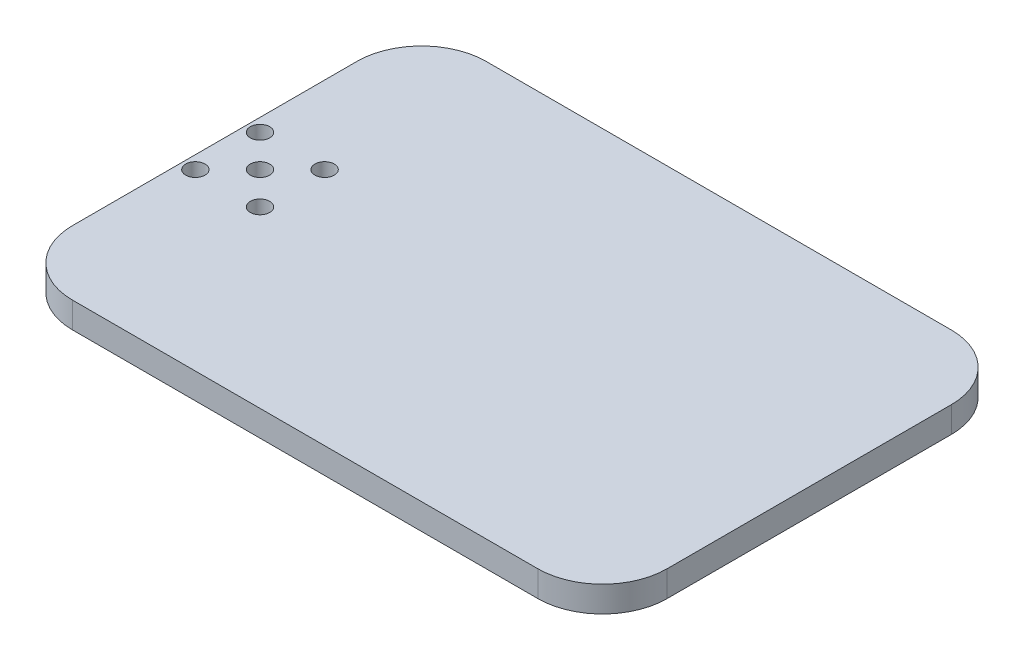
ISO-10303-21;
HEADER;
FILE_DESCRIPTION(('STEP AP214'),'2;1');
FILE_NAME('part.step','',(''),(''),'','','');
FILE_SCHEMA(('AUTOMOTIVE_DESIGN { 1 0 10303 214 1 1 1 1 }'));
ENDSEC;
DATA;
#1=APPLICATION_CONTEXT('core data for automotive mechanical design processes');
#2=APPLICATION_PROTOCOL_DEFINITION('international standard','automotive_design',2000,#1);
#3=PRODUCT_CONTEXT('',#1,'mechanical');
#4=PRODUCT('Part','Part','',(#3));
#5=PRODUCT_RELATED_PRODUCT_CATEGORY('part','',(#4));
#6=PRODUCT_DEFINITION_FORMATION('','',#4);
#7=PRODUCT_DEFINITION_CONTEXT('part definition',#1,'design');
#8=PRODUCT_DEFINITION('design','',#6,#7);
#9=PRODUCT_DEFINITION_SHAPE('','',#8);
#10=(LENGTH_UNIT() NAMED_UNIT(*) SI_UNIT(.MILLI.,.METRE.));
#11=(NAMED_UNIT(*) PLANE_ANGLE_UNIT() SI_UNIT($,.RADIAN.));
#12=(NAMED_UNIT(*) SI_UNIT($,.STERADIAN.) SOLID_ANGLE_UNIT());
#13=UNCERTAINTY_MEASURE_WITH_UNIT(LENGTH_MEASURE(1.E-05),#10,'distance_accuracy_value','');
#14=(GEOMETRIC_REPRESENTATION_CONTEXT(3) GLOBAL_UNCERTAINTY_ASSIGNED_CONTEXT((#13)) GLOBAL_UNIT_ASSIGNED_CONTEXT((#10,
#11,#12)) REPRESENTATION_CONTEXT('',''));
#15=CARTESIAN_POINT('',(0.,0.,0.));
#16=DIRECTION('',(0.,0.,1.));
#17=DIRECTION('',(1.,0.,0.));
#18=AXIS2_PLACEMENT_3D('',#15,#16,#17);
#19=CARTESIAN_POINT('',(5.,2.,-5.));
#20=DIRECTION('',(0.,-1.,0.));
#21=DIRECTION('',(0.,0.,-1.));
#22=AXIS2_PLACEMENT_3D('',#19,#20,#21);
#23=CYLINDRICAL_SURFACE('',#22,5.);
#24=CARTESIAN_POINT('',(5.,0.,-5.));
#25=DIRECTION('',(0.,1.,0.));
#26=DIRECTION('',(0.,0.,-1.));
#27=AXIS2_PLACEMENT_3D('',#24,#25,#26);
#28=CIRCLE('',#27,5.);
#29=CARTESIAN_POINT('',(0.,0.,-5.));
#30=VERTEX_POINT('',#29);
#31=CARTESIAN_POINT('',(5.,0.,0.));
#32=VERTEX_POINT('',#31);
#33=EDGE_CURVE('E131',#30,#32,#28,.T.);
#34=ORIENTED_EDGE('',*,*,#33,.T.);
#35=DIRECTION('',(0.,-1.,0.));
#36=VECTOR('',#35,1.);
#37=CARTESIAN_POINT('',(5.,2.,0.));
#38=LINE('',#37,#36);
#39=CARTESIAN_POINT('',(5.,2.,0.));
#40=VERTEX_POINT('',#39);
#41=EDGE_CURVE('E11',#40,#32,#38,.T.);
#42=ORIENTED_EDGE('',*,*,#41,.F.);
#43=CARTESIAN_POINT('',(5.,2.,-5.));
#44=DIRECTION('',(0.,1.,0.));
#45=DIRECTION('',(0.,0.,-1.));
#46=AXIS2_PLACEMENT_3D('',#43,#44,#45);
#47=CIRCLE('',#46,5.);
#48=CARTESIAN_POINT('',(0.,2.,-5.));
#49=VERTEX_POINT('',#48);
#50=EDGE_CURVE('E146',#49,#40,#47,.T.);
#51=ORIENTED_EDGE('',*,*,#50,.F.);
#52=DIRECTION('',(0.,-1.,0.));
#53=VECTOR('',#52,1.);
#54=CARTESIAN_POINT('',(0.,2.,-5.));
#55=LINE('',#54,#53);
#56=EDGE_CURVE('E127',#49,#30,#55,.T.);
#57=ORIENTED_EDGE('',*,*,#56,.T.);
#58=EDGE_LOOP('',(#34,#42,#51,#57));
#59=FACE_BOUND('',#58,.T.);
#60=ADVANCED_FACE('F35',(#59),#23,.T.);
#61=CARTESIAN_POINT('',(5.,2.,0.));
#62=DIRECTION('',(0.,0.,-1.));
#63=DIRECTION('',(-1.,0.,0.));
#64=AXIS2_PLACEMENT_3D('',#61,#62,#63);
#65=PLANE('',#64);
#66=DIRECTION('',(1.,0.,0.));
#67=VECTOR('',#66,1.);
#68=CARTESIAN_POINT('',(5.,0.,0.));
#69=LINE('',#68,#67);
#70=CARTESIAN_POINT('',(41.,0.,0.));
#71=VERTEX_POINT('',#70);
#72=EDGE_CURVE('E134',#32,#71,#69,.T.);
#73=ORIENTED_EDGE('',*,*,#72,.T.);
#74=DIRECTION('',(0.,-1.,0.));
#75=VECTOR('',#74,1.);
#76=CARTESIAN_POINT('',(41.,2.,0.));
#77=LINE('',#76,#75);
#78=CARTESIAN_POINT('',(41.,2.,0.));
#79=VERTEX_POINT('',#78);
#80=EDGE_CURVE('E43',#79,#71,#77,.T.);
#81=ORIENTED_EDGE('',*,*,#80,.F.);
#82=DIRECTION('',(1.,0.,0.));
#83=VECTOR('',#82,1.);
#84=CARTESIAN_POINT('',(5.,2.,0.));
#85=LINE('',#84,#83);
#86=EDGE_CURVE('E94',#40,#79,#85,.T.);
#87=ORIENTED_EDGE('',*,*,#86,.F.);
#88=ORIENTED_EDGE('',*,*,#41,.T.);
#89=EDGE_LOOP('',(#73,#81,#87,#88));
#90=FACE_BOUND('',#89,.T.);
#91=ADVANCED_FACE('F239',(#90),#65,.F.);
#92=CARTESIAN_POINT('',(41.,2.,-5.));
#93=DIRECTION('',(0.,-1.,0.));
#94=DIRECTION('',(0.,0.,-1.));
#95=AXIS2_PLACEMENT_3D('',#92,#93,#94);
#96=CYLINDRICAL_SURFACE('',#95,5.);
#97=CARTESIAN_POINT('',(41.,0.,-5.));
#98=DIRECTION('',(0.,1.,0.));
#99=DIRECTION('',(0.,0.,1.));
#100=AXIS2_PLACEMENT_3D('',#97,#98,#99);
#101=CIRCLE('',#100,5.);
#102=CARTESIAN_POINT('',(46.,0.,-5.));
#103=VERTEX_POINT('',#102);
#104=EDGE_CURVE('E137',#71,#103,#101,.T.);
#105=ORIENTED_EDGE('',*,*,#104,.T.);
#106=DIRECTION('',(0.,-1.,0.));
#107=VECTOR('',#106,1.);
#108=CARTESIAN_POINT('',(46.,2.,-5.));
#109=LINE('',#108,#107);
#110=CARTESIAN_POINT('',(46.,2.,-5.));
#111=VERTEX_POINT('',#110);
#112=EDGE_CURVE('E153',#111,#103,#109,.T.);
#113=ORIENTED_EDGE('',*,*,#112,.F.);
#114=CARTESIAN_POINT('',(41.,2.,-5.));
#115=DIRECTION('',(0.,1.,0.));
#116=DIRECTION('',(0.,0.,1.));
#117=AXIS2_PLACEMENT_3D('',#114,#115,#116);
#118=CIRCLE('',#117,5.);
#119=EDGE_CURVE('E161',#79,#111,#118,.T.);
#120=ORIENTED_EDGE('',*,*,#119,.F.);
#121=ORIENTED_EDGE('',*,*,#80,.T.);
#122=EDGE_LOOP('',(#105,#113,#120,#121));
#123=FACE_BOUND('',#122,.T.);
#124=ADVANCED_FACE('F159',(#123),#96,.T.);
#125=CARTESIAN_POINT('',(46.,2.,-5.));
#126=DIRECTION('',(-1.,0.,0.));
#127=DIRECTION('',(0.,0.,1.));
#128=AXIS2_PLACEMENT_3D('',#125,#126,#127);
#129=PLANE('',#128);
#130=DIRECTION('',(0.,0.,-1.));
#131=VECTOR('',#130,1.);
#132=CARTESIAN_POINT('',(46.,0.,-5.));
#133=LINE('',#132,#131);
#134=CARTESIAN_POINT('',(46.,0.,-27.));
#135=VERTEX_POINT('',#134);
#136=EDGE_CURVE('E139',#103,#135,#133,.T.);
#137=ORIENTED_EDGE('',*,*,#136,.T.);
#138=DIRECTION('',(0.,-1.,0.));
#139=VECTOR('',#138,1.);
#140=CARTESIAN_POINT('',(46.,2.,-27.));
#141=LINE('',#140,#139);
#142=CARTESIAN_POINT('',(46.,2.,-27.));
#143=VERTEX_POINT('',#142);
#144=EDGE_CURVE('E150',#143,#135,#141,.T.);
#145=ORIENTED_EDGE('',*,*,#144,.F.);
#146=DIRECTION('',(0.,0.,-1.));
#147=VECTOR('',#146,1.);
#148=CARTESIAN_POINT('',(46.,2.,-5.));
#149=LINE('',#148,#147);
#150=EDGE_CURVE('E173',#111,#143,#149,.T.);
#151=ORIENTED_EDGE('',*,*,#150,.F.);
#152=ORIENTED_EDGE('',*,*,#112,.T.);
#153=EDGE_LOOP('',(#137,#145,#151,#152));
#154=FACE_BOUND('',#153,.T.);
#155=ADVANCED_FACE('F169',(#154),#129,.F.);
#156=CARTESIAN_POINT('',(41.,2.,-27.));
#157=DIRECTION('',(0.,-1.,0.));
#158=DIRECTION('',(0.,0.,-1.));
#159=AXIS2_PLACEMENT_3D('',#156,#157,#158);
#160=CYLINDRICAL_SURFACE('',#159,5.);
#161=CARTESIAN_POINT('',(41.,0.,-27.));
#162=DIRECTION('',(0.,1.,0.));
#163=DIRECTION('',(0.,0.,-1.));
#164=AXIS2_PLACEMENT_3D('',#161,#162,#163);
#165=CIRCLE('',#164,5.);
#166=CARTESIAN_POINT('',(41.,0.,-32.));
#167=VERTEX_POINT('',#166);
#168=EDGE_CURVE('E141',#135,#167,#165,.T.);
#169=ORIENTED_EDGE('',*,*,#168,.T.);
#170=DIRECTION('',(0.,-1.,0.));
#171=VECTOR('',#170,1.);
#172=CARTESIAN_POINT('',(41.,2.,-32.));
#173=LINE('',#172,#171);
#174=CARTESIAN_POINT('',(41.,2.,-32.));
#175=VERTEX_POINT('',#174);
#176=EDGE_CURVE('E122',#175,#167,#173,.T.);
#177=ORIENTED_EDGE('',*,*,#176,.F.);
#178=CARTESIAN_POINT('',(41.,2.,-27.));
#179=DIRECTION('',(0.,1.,0.));
#180=DIRECTION('',(0.,0.,-1.));
#181=AXIS2_PLACEMENT_3D('',#178,#179,#180);
#182=CIRCLE('',#181,5.);
#183=EDGE_CURVE('E113',#143,#175,#182,.T.);
#184=ORIENTED_EDGE('',*,*,#183,.F.);
#185=ORIENTED_EDGE('',*,*,#144,.T.);
#186=EDGE_LOOP('',(#169,#177,#184,#185));
#187=FACE_BOUND('',#186,.T.);
#188=ADVANCED_FACE('F172',(#187),#160,.T.);
#189=CARTESIAN_POINT('',(5.,2.,-32.));
#190=DIRECTION('',(0.,0.,1.));
#191=DIRECTION('',(1.,0.,0.));
#192=AXIS2_PLACEMENT_3D('',#189,#190,#191);
#193=PLANE('',#192);
#194=DIRECTION('',(-1.,0.,0.));
#195=VECTOR('',#194,1.);
#196=CARTESIAN_POINT('',(5.,0.,-32.));
#197=LINE('',#196,#195);
#198=CARTESIAN_POINT('',(5.,0.,-32.));
#199=VERTEX_POINT('',#198);
#200=EDGE_CURVE('E121',#167,#199,#197,.T.);
#201=ORIENTED_EDGE('',*,*,#200,.T.);
#202=DIRECTION('',(0.,-1.,0.));
#203=VECTOR('',#202,1.);
#204=CARTESIAN_POINT('',(5.,2.,-32.));
#205=LINE('',#204,#203);
#206=CARTESIAN_POINT('',(5.,2.,-32.));
#207=VERTEX_POINT('',#206);
#208=EDGE_CURVE('E118',#207,#199,#205,.T.);
#209=ORIENTED_EDGE('',*,*,#208,.F.);
#210=DIRECTION('',(-1.,0.,0.));
#211=VECTOR('',#210,1.);
#212=CARTESIAN_POINT('',(5.,2.,-32.));
#213=LINE('',#212,#211);
#214=EDGE_CURVE('E107',#175,#207,#213,.T.);
#215=ORIENTED_EDGE('',*,*,#214,.F.);
#216=ORIENTED_EDGE('',*,*,#176,.T.);
#217=EDGE_LOOP('',(#201,#209,#215,#216));
#218=FACE_BOUND('',#217,.T.);
#219=ADVANCED_FACE('F119',(#218),#193,.F.);
#220=CARTESIAN_POINT('',(5.,2.,-27.));
#221=DIRECTION('',(0.,-1.,0.));
#222=DIRECTION('',(0.,0.,-1.));
#223=AXIS2_PLACEMENT_3D('',#220,#221,#222);
#224=CYLINDRICAL_SURFACE('',#223,5.);
#225=CARTESIAN_POINT('',(5.,0.,-27.));
#226=DIRECTION('',(0.,1.,0.));
#227=DIRECTION('',(0.,0.,-1.));
#228=AXIS2_PLACEMENT_3D('',#225,#226,#227);
#229=CIRCLE('',#228,5.);
#230=CARTESIAN_POINT('',(0.,0.,-27.));
#231=VERTEX_POINT('',#230);
#232=EDGE_CURVE('E80',#199,#231,#229,.T.);
#233=ORIENTED_EDGE('',*,*,#232,.T.);
#234=DIRECTION('',(0.,-1.,0.));
#235=VECTOR('',#234,1.);
#236=CARTESIAN_POINT('',(0.,2.,-27.));
#237=LINE('',#236,#235);
#238=CARTESIAN_POINT('',(0.,2.,-27.));
#239=VERTEX_POINT('',#238);
#240=EDGE_CURVE('E123',#239,#231,#237,.T.);
#241=ORIENTED_EDGE('',*,*,#240,.F.);
#242=CARTESIAN_POINT('',(5.,2.,-27.));
#243=DIRECTION('',(0.,1.,0.));
#244=DIRECTION('',(0.,0.,-1.));
#245=AXIS2_PLACEMENT_3D('',#242,#243,#244);
#246=CIRCLE('',#245,5.);
#247=EDGE_CURVE('E111',#207,#239,#246,.T.);
#248=ORIENTED_EDGE('',*,*,#247,.F.);
#249=ORIENTED_EDGE('',*,*,#208,.T.);
#250=EDGE_LOOP('',(#233,#241,#248,#249));
#251=FACE_BOUND('',#250,.T.);
#252=ADVANCED_FACE('F125',(#251),#224,.T.);
#253=CARTESIAN_POINT('',(0.,2.,-5.));
#254=DIRECTION('',(1.,0.,0.));
#255=DIRECTION('',(0.,0.,-1.));
#256=AXIS2_PLACEMENT_3D('',#253,#254,#255);
#257=PLANE('',#256);
#258=DIRECTION('',(0.,0.,1.));
#259=VECTOR('',#258,1.);
#260=CARTESIAN_POINT('',(0.,0.,-5.));
#261=LINE('',#260,#259);
#262=EDGE_CURVE('E86',#231,#30,#261,.T.);
#263=ORIENTED_EDGE('',*,*,#262,.T.);
#264=ORIENTED_EDGE('',*,*,#56,.F.);
#265=DIRECTION('',(0.,0.,1.));
#266=VECTOR('',#265,1.);
#267=CARTESIAN_POINT('',(0.,2.,-5.));
#268=LINE('',#267,#266);
#269=EDGE_CURVE('E51',#239,#49,#268,.T.);
#270=ORIENTED_EDGE('',*,*,#269,.F.);
#271=ORIENTED_EDGE('',*,*,#240,.T.);
#272=EDGE_LOOP('',(#263,#264,#270,#271));
#273=FACE_BOUND('',#272,.T.);
#274=ADVANCED_FACE('F213',(#273),#257,.F.);
#275=CARTESIAN_POINT('',(5.,2.,-5.));
#276=DIRECTION('',(0.,-1.,0.));
#277=DIRECTION('',(0.,0.,-1.));
#278=AXIS2_PLACEMENT_3D('',#275,#276,#277);
#279=PLANE('',#278);
#280=CARTESIAN_POINT('',(0.999999999999996,2.,-18.4999929533988));
#281=DIRECTION('',(0.,1.,0.));
#282=DIRECTION('',(0.,0.,1.));
#283=AXIS2_PLACEMENT_3D('',#280,#281,#282);
#284=CIRCLE('',#283,0.750000000000001);
#285=CARTESIAN_POINT('',(0.999999999999996,2.,-17.7499929533988));
#286=VERTEX_POINT('',#285);
#287=EDGE_CURVE('E200',#286,#286,#284,.T.);
#288=ORIENTED_EDGE('',*,*,#287,.F.);
#289=EDGE_LOOP('',(#288));
#290=FACE_BOUND('',#289,.T.);
#291=CARTESIAN_POINT('',(0.999999999999995,2.,-13.4999929533988));
#292=DIRECTION('',(0.,1.,0.));
#293=DIRECTION('',(0.,0.,1.));
#294=AXIS2_PLACEMENT_3D('',#291,#292,#293);
#295=CIRCLE('',#294,0.750000000000001);
#296=CARTESIAN_POINT('',(0.999999999999995,2.,-12.7499929533988));
#297=VERTEX_POINT('',#296);
#298=EDGE_CURVE('E194',#297,#297,#295,.T.);
#299=ORIENTED_EDGE('',*,*,#298,.F.);
#300=EDGE_LOOP('',(#299));
#301=FACE_BOUND('',#300,.T.);
#302=CARTESIAN_POINT('',(5.99999999999999,2.,-13.5));
#303=DIRECTION('',(0.,1.,0.));
#304=DIRECTION('',(0.,0.,1.));
#305=AXIS2_PLACEMENT_3D('',#302,#303,#304);
#306=CIRCLE('',#305,0.750000000000001);
#307=CARTESIAN_POINT('',(5.99999999999999,2.,-12.75));
#308=VERTEX_POINT('',#307);
#309=EDGE_CURVE('E188',#308,#308,#306,.T.);
#310=ORIENTED_EDGE('',*,*,#309,.F.);
#311=EDGE_LOOP('',(#310));
#312=FACE_BOUND('',#311,.T.);
#313=CARTESIAN_POINT('',(6.,2.,-18.5));
#314=DIRECTION('',(0.,1.,0.));
#315=DIRECTION('',(0.,0.,1.));
#316=AXIS2_PLACEMENT_3D('',#313,#314,#315);
#317=CIRCLE('',#316,0.750000000000001);
#318=CARTESIAN_POINT('',(6.,2.,-17.75));
#319=VERTEX_POINT('',#318);
#320=EDGE_CURVE('E182',#319,#319,#317,.T.);
#321=ORIENTED_EDGE('',*,*,#320,.F.);
#322=EDGE_LOOP('',(#321));
#323=FACE_BOUND('',#322,.T.);
#324=CARTESIAN_POINT('',(3.5,2.,-16.));
#325=DIRECTION('',(0.,1.,0.));
#326=DIRECTION('',(0.,0.,1.));
#327=AXIS2_PLACEMENT_3D('',#324,#325,#326);
#328=CIRCLE('',#327,0.75);
#329=CARTESIAN_POINT('',(3.5,2.,-15.25));
#330=VERTEX_POINT('',#329);
#331=EDGE_CURVE('E135',#330,#330,#328,.T.);
#332=ORIENTED_EDGE('',*,*,#331,.F.);
#333=EDGE_LOOP('',(#332));
#334=FACE_BOUND('',#333,.T.);
#335=ORIENTED_EDGE('',*,*,#50,.T.);
#336=ORIENTED_EDGE('',*,*,#86,.T.);
#337=ORIENTED_EDGE('',*,*,#119,.T.);
#338=ORIENTED_EDGE('',*,*,#150,.T.);
#339=ORIENTED_EDGE('',*,*,#183,.T.);
#340=ORIENTED_EDGE('',*,*,#214,.T.);
#341=ORIENTED_EDGE('',*,*,#247,.T.);
#342=ORIENTED_EDGE('',*,*,#269,.T.);
#343=EDGE_LOOP('',(#335,#336,#337,#338,#339,#340,#341,#342));
#344=FACE_BOUND('',#343,.T.);
#345=ADVANCED_FACE('F109',(#290,#301,#312,#323,#334,#344),#279,.F.);
#346=CARTESIAN_POINT('',(5.,0.,-5.));
#347=DIRECTION('',(0.,-1.,0.));
#348=DIRECTION('',(0.,0.,-1.));
#349=AXIS2_PLACEMENT_3D('',#346,#347,#348);
#350=PLANE('',#349);
#351=CARTESIAN_POINT('',(0.999999999999996,0.,-18.4999929533988));
#352=DIRECTION('',(0.,-1.,0.));
#353=DIRECTION('',(0.,0.,-1.));
#354=AXIS2_PLACEMENT_3D('',#351,#352,#353);
#355=CIRCLE('',#354,0.750000000000001);
#356=CARTESIAN_POINT('',(0.999999999999996,0.,-19.2499929533988));
#357=VERTEX_POINT('',#356);
#358=EDGE_CURVE('E203',#357,#357,#355,.F.);
#359=ORIENTED_EDGE('',*,*,#358,.T.);
#360=EDGE_LOOP('',(#359));
#361=FACE_BOUND('',#360,.T.);
#362=CARTESIAN_POINT('',(0.999999999999995,0.,-13.4999929533988));
#363=DIRECTION('',(0.,-1.,0.));
#364=DIRECTION('',(0.,0.,-1.));
#365=AXIS2_PLACEMENT_3D('',#362,#363,#364);
#366=CIRCLE('',#365,0.750000000000001);
#367=CARTESIAN_POINT('',(0.999999999999995,0.,-14.2499929533988));
#368=VERTEX_POINT('',#367);
#369=EDGE_CURVE('E197',#368,#368,#366,.F.);
#370=ORIENTED_EDGE('',*,*,#369,.T.);
#371=EDGE_LOOP('',(#370));
#372=FACE_BOUND('',#371,.T.);
#373=CARTESIAN_POINT('',(5.99999999999999,0.,-13.5));
#374=DIRECTION('',(0.,-1.,0.));
#375=DIRECTION('',(0.,0.,-1.));
#376=AXIS2_PLACEMENT_3D('',#373,#374,#375);
#377=CIRCLE('',#376,0.750000000000001);
#378=CARTESIAN_POINT('',(5.99999999999999,0.,-14.25));
#379=VERTEX_POINT('',#378);
#380=EDGE_CURVE('E191',#379,#379,#377,.F.);
#381=ORIENTED_EDGE('',*,*,#380,.T.);
#382=EDGE_LOOP('',(#381));
#383=FACE_BOUND('',#382,.T.);
#384=CARTESIAN_POINT('',(6.,0.,-18.5));
#385=DIRECTION('',(0.,-1.,0.));
#386=DIRECTION('',(0.,0.,-1.));
#387=AXIS2_PLACEMENT_3D('',#384,#385,#386);
#388=CIRCLE('',#387,0.750000000000001);
#389=CARTESIAN_POINT('',(6.,0.,-19.25));
#390=VERTEX_POINT('',#389);
#391=EDGE_CURVE('E185',#390,#390,#388,.F.);
#392=ORIENTED_EDGE('',*,*,#391,.T.);
#393=EDGE_LOOP('',(#392));
#394=FACE_BOUND('',#393,.T.);
#395=CARTESIAN_POINT('',(3.5,0.,-16.));
#396=DIRECTION('',(0.,-1.,0.));
#397=DIRECTION('',(0.,0.,-1.));
#398=AXIS2_PLACEMENT_3D('',#395,#396,#397);
#399=CIRCLE('',#398,0.75);
#400=CARTESIAN_POINT('',(3.5,0.,-16.75));
#401=VERTEX_POINT('',#400);
#402=EDGE_CURVE('E179',#401,#401,#399,.F.);
#403=ORIENTED_EDGE('',*,*,#402,.T.);
#404=EDGE_LOOP('',(#403));
#405=FACE_BOUND('',#404,.T.);
#406=ORIENTED_EDGE('',*,*,#33,.F.);
#407=ORIENTED_EDGE('',*,*,#262,.F.);
#408=ORIENTED_EDGE('',*,*,#232,.F.);
#409=ORIENTED_EDGE('',*,*,#200,.F.);
#410=ORIENTED_EDGE('',*,*,#168,.F.);
#411=ORIENTED_EDGE('',*,*,#136,.F.);
#412=ORIENTED_EDGE('',*,*,#104,.F.);
#413=ORIENTED_EDGE('',*,*,#72,.F.);
#414=EDGE_LOOP('',(#406,#407,#408,#409,#410,#411,#412,#413));
#415=FACE_BOUND('',#414,.T.);
#416=ADVANCED_FACE('F165',(#361,#372,#383,#394,#405,#415),#350,.T.);
#417=CARTESIAN_POINT('',(3.5,-0.00100000000000013,-16.));
#418=DIRECTION('',(0.,1.,0.));
#419=DIRECTION('',(0.,0.,1.));
#420=AXIS2_PLACEMENT_3D('',#417,#418,#419);
#421=CYLINDRICAL_SURFACE('',#420,0.75);
#422=ORIENTED_EDGE('',*,*,#402,.F.);
#423=EDGE_LOOP('',(#422));
#424=FACE_BOUND('',#423,.T.);
#425=ORIENTED_EDGE('',*,*,#331,.T.);
#426=EDGE_LOOP('',(#425));
#427=FACE_BOUND('',#426,.T.);
#428=ADVANCED_FACE('F223',(#424,#427),#421,.F.);
#429=CARTESIAN_POINT('',(6.,-0.00100000000000013,-18.5));
#430=DIRECTION('',(0.,1.,0.));
#431=DIRECTION('',(0.,0.,1.));
#432=AXIS2_PLACEMENT_3D('',#429,#430,#431);
#433=CYLINDRICAL_SURFACE('',#432,0.750000000000001);
#434=ORIENTED_EDGE('',*,*,#391,.F.);
#435=EDGE_LOOP('',(#434));
#436=FACE_BOUND('',#435,.T.);
#437=ORIENTED_EDGE('',*,*,#320,.T.);
#438=EDGE_LOOP('',(#437));
#439=FACE_BOUND('',#438,.T.);
#440=ADVANCED_FACE('F225',(#436,#439),#433,.F.);
#441=CARTESIAN_POINT('',(5.99999999999999,-0.00100000000000013,-13.5));
#442=DIRECTION('',(0.,1.,0.));
#443=DIRECTION('',(0.,0.,1.));
#444=AXIS2_PLACEMENT_3D('',#441,#442,#443);
#445=CYLINDRICAL_SURFACE('',#444,0.750000000000001);
#446=ORIENTED_EDGE('',*,*,#380,.F.);
#447=EDGE_LOOP('',(#446));
#448=FACE_BOUND('',#447,.T.);
#449=ORIENTED_EDGE('',*,*,#309,.T.);
#450=EDGE_LOOP('',(#449));
#451=FACE_BOUND('',#450,.T.);
#452=ADVANCED_FACE('F232',(#448,#451),#445,.F.);
#453=CARTESIAN_POINT('',(0.999999999999995,-0.00100000000000013,-13.4999929533988));
#454=DIRECTION('',(0.,1.,0.));
#455=DIRECTION('',(0.,0.,1.));
#456=AXIS2_PLACEMENT_3D('',#453,#454,#455);
#457=CYLINDRICAL_SURFACE('',#456,0.750000000000001);
#458=ORIENTED_EDGE('',*,*,#369,.F.);
#459=EDGE_LOOP('',(#458));
#460=FACE_BOUND('',#459,.T.);
#461=ORIENTED_EDGE('',*,*,#298,.T.);
#462=EDGE_LOOP('',(#461));
#463=FACE_BOUND('',#462,.T.);
#464=ADVANCED_FACE('F315',(#460,#463),#457,.F.);
#465=CARTESIAN_POINT('',(0.999999999999996,-0.00100000000000013,-18.4999929533988));
#466=DIRECTION('',(0.,1.,0.));
#467=DIRECTION('',(0.,0.,1.));
#468=AXIS2_PLACEMENT_3D('',#465,#466,#467);
#469=CYLINDRICAL_SURFACE('',#468,0.750000000000001);
#470=ORIENTED_EDGE('',*,*,#358,.F.);
#471=EDGE_LOOP('',(#470));
#472=FACE_BOUND('',#471,.T.);
#473=ORIENTED_EDGE('',*,*,#287,.T.);
#474=EDGE_LOOP('',(#473));
#475=FACE_BOUND('',#474,.T.);
#476=ADVANCED_FACE('F209',(#472,#475),#469,.F.);
#477=CLOSED_SHELL('',(#60,#91,#124,#155,#188,#219,#252,#274,#345,#416,#428,#440,#452,#464,#476));
#478=MANIFOLD_SOLID_BREP('B2',#477);
#479=ADVANCED_BREP_SHAPE_REPRESENTATION('',(#18,#478),#14);
#480=SHAPE_DEFINITION_REPRESENTATION(#9,#479);
ENDSEC;
END-ISO-10303-21;
